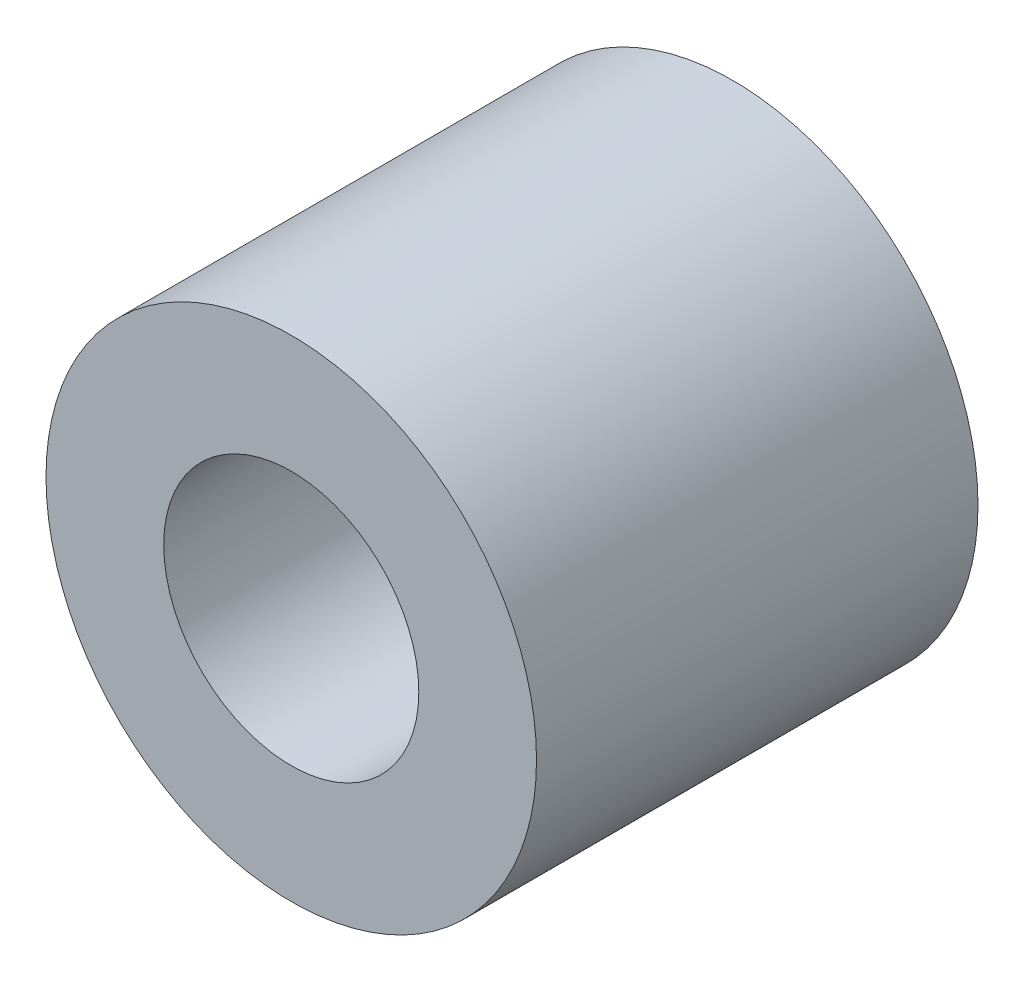
ISO-10303-21;
HEADER;
FILE_DESCRIPTION(('STEP AP214'),'2;1');
FILE_NAME('part.step','',(''),(''),'','','');
FILE_SCHEMA(('AUTOMOTIVE_DESIGN { 1 0 10303 214 1 1 1 1 }'));
ENDSEC;
DATA;
#1=APPLICATION_CONTEXT('core data for automotive mechanical design processes');
#2=APPLICATION_PROTOCOL_DEFINITION('international standard','automotive_design',2000,#1);
#3=PRODUCT_CONTEXT('',#1,'mechanical');
#4=PRODUCT('Part','Part','',(#3));
#5=PRODUCT_RELATED_PRODUCT_CATEGORY('part','',(#4));
#6=PRODUCT_DEFINITION_FORMATION('','',#4);
#7=PRODUCT_DEFINITION_CONTEXT('part definition',#1,'design');
#8=PRODUCT_DEFINITION('design','',#6,#7);
#9=PRODUCT_DEFINITION_SHAPE('','',#8);
#10=(LENGTH_UNIT() NAMED_UNIT(*) SI_UNIT(.MILLI.,.METRE.));
#11=(NAMED_UNIT(*) PLANE_ANGLE_UNIT() SI_UNIT($,.RADIAN.));
#12=(NAMED_UNIT(*) SI_UNIT($,.STERADIAN.) SOLID_ANGLE_UNIT());
#13=UNCERTAINTY_MEASURE_WITH_UNIT(LENGTH_MEASURE(1.E-05),#10,'distance_accuracy_value','');
#14=(GEOMETRIC_REPRESENTATION_CONTEXT(3) GLOBAL_UNCERTAINTY_ASSIGNED_CONTEXT((#13)) GLOBAL_UNIT_ASSIGNED_CONTEXT((#10,
#11,#12)) REPRESENTATION_CONTEXT('',''));
#15=CARTESIAN_POINT('',(0.,0.,0.));
#16=DIRECTION('',(0.,0.,1.));
#17=DIRECTION('',(1.,0.,0.));
#18=AXIS2_PLACEMENT_3D('',#15,#16,#17);
#19=CARTESIAN_POINT('',(0.,0.,9.));
#20=DIRECTION('',(0.,0.,1.));
#21=DIRECTION('',(1.,0.,0.));
#22=AXIS2_PLACEMENT_3D('',#19,#20,#21);
#23=PLANE('',#22);
#24=CARTESIAN_POINT('',(0.,0.,9.));
#25=DIRECTION('',(0.,0.,1.));
#26=DIRECTION('',(1.,0.,0.));
#27=AXIS2_PLACEMENT_3D('',#24,#25,#26);
#28=CIRCLE('',#27,5.);
#29=CARTESIAN_POINT('',(5.,0.,9.));
#30=VERTEX_POINT('',#29);
#31=EDGE_CURVE('E10',#30,#30,#28,.T.);
#32=ORIENTED_EDGE('',*,*,#31,.T.);
#33=EDGE_LOOP('',(#32));
#34=FACE_BOUND('',#33,.T.);
#35=CARTESIAN_POINT('',(0.,0.,9.));
#36=DIRECTION('',(0.,0.,1.));
#37=DIRECTION('',(1.,0.,0.));
#38=AXIS2_PLACEMENT_3D('',#35,#36,#37);
#39=CIRCLE('',#38,2.6);
#40=CARTESIAN_POINT('',(2.6,0.,9.));
#41=VERTEX_POINT('',#40);
#42=EDGE_CURVE('E41',#41,#41,#39,.T.);
#43=ORIENTED_EDGE('',*,*,#42,.F.);
#44=EDGE_LOOP('',(#43));
#45=FACE_BOUND('',#44,.T.);
#46=ADVANCED_FACE('F30',(#34,#45),#23,.T.);
#47=CARTESIAN_POINT('',(0.,0.,0.));
#48=DIRECTION('',(0.,0.,1.));
#49=DIRECTION('',(1.,0.,0.));
#50=AXIS2_PLACEMENT_3D('',#47,#48,#49);
#51=PLANE('',#50);
#52=CARTESIAN_POINT('',(0.,0.,0.));
#53=DIRECTION('',(0.,0.,1.));
#54=DIRECTION('',(1.,0.,0.));
#55=AXIS2_PLACEMENT_3D('',#52,#53,#54);
#56=CIRCLE('',#55,5.);
#57=CARTESIAN_POINT('',(5.,0.,0.));
#58=VERTEX_POINT('',#57);
#59=EDGE_CURVE('E34',#58,#58,#56,.T.);
#60=ORIENTED_EDGE('',*,*,#59,.F.);
#61=EDGE_LOOP('',(#60));
#62=FACE_BOUND('',#61,.T.);
#63=CARTESIAN_POINT('',(0.,0.,0.));
#64=DIRECTION('',(0.,0.,1.));
#65=DIRECTION('',(1.,0.,0.));
#66=AXIS2_PLACEMENT_3D('',#63,#64,#65);
#67=CIRCLE('',#66,2.6);
#68=CARTESIAN_POINT('',(2.6,0.,0.));
#69=VERTEX_POINT('',#68);
#70=EDGE_CURVE('E43',#69,#69,#67,.T.);
#71=ORIENTED_EDGE('',*,*,#70,.T.);
#72=EDGE_LOOP('',(#71));
#73=FACE_BOUND('',#72,.T.);
#74=ADVANCED_FACE('F53',(#62,#73),#51,.F.);
#75=CARTESIAN_POINT('',(0.,0.,9.));
#76=DIRECTION('',(0.,0.,-1.));
#77=DIRECTION('',(-1.,0.,0.));
#78=AXIS2_PLACEMENT_3D('',#75,#76,#77);
#79=CYLINDRICAL_SURFACE('',#78,5.);
#80=ORIENTED_EDGE('',*,*,#31,.F.);
#81=EDGE_LOOP('',(#80));
#82=FACE_BOUND('',#81,.T.);
#83=ORIENTED_EDGE('',*,*,#59,.T.);
#84=EDGE_LOOP('',(#83));
#85=FACE_BOUND('',#84,.T.);
#86=ADVANCED_FACE('F32',(#82,#85),#79,.T.);
#87=CARTESIAN_POINT('',(0.,0.,9.));
#88=DIRECTION('',(0.,0.,-1.));
#89=DIRECTION('',(-1.,0.,0.));
#90=AXIS2_PLACEMENT_3D('',#87,#88,#89);
#91=CYLINDRICAL_SURFACE('',#90,2.6);
#92=ORIENTED_EDGE('',*,*,#42,.T.);
#93=EDGE_LOOP('',(#92));
#94=FACE_BOUND('',#93,.T.);
#95=ORIENTED_EDGE('',*,*,#70,.F.);
#96=EDGE_LOOP('',(#95));
#97=FACE_BOUND('',#96,.T.);
#98=ADVANCED_FACE('F49',(#94,#97),#91,.F.);
#99=CLOSED_SHELL('',(#46,#74,#86,#98));
#100=MANIFOLD_SOLID_BREP('B2',#99);
#101=ADVANCED_BREP_SHAPE_REPRESENTATION('',(#18,#100),#14);
#102=SHAPE_DEFINITION_REPRESENTATION(#9,#101);
ENDSEC;
END-ISO-10303-21;
